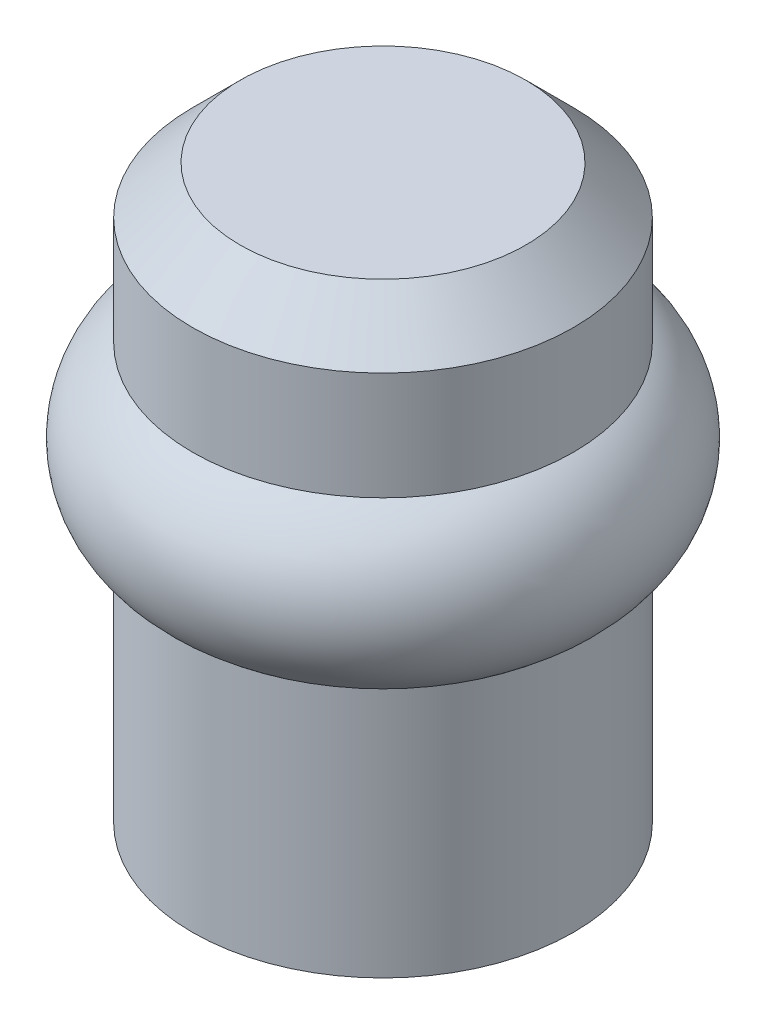
ISO-10303-21;
HEADER;
FILE_DESCRIPTION(('STEP AP214'),'2;1');
FILE_NAME('part.step','',(''),(''),'','','');
FILE_SCHEMA(('AUTOMOTIVE_DESIGN { 1 0 10303 214 1 1 1 1 }'));
ENDSEC;
DATA;
#1=APPLICATION_CONTEXT('core data for automotive mechanical design processes');
#2=APPLICATION_PROTOCOL_DEFINITION('international standard','automotive_design',2000,#1);
#3=PRODUCT_CONTEXT('',#1,'mechanical');
#4=PRODUCT('Part','Part','',(#3));
#5=PRODUCT_RELATED_PRODUCT_CATEGORY('part','',(#4));
#6=PRODUCT_DEFINITION_FORMATION('','',#4);
#7=PRODUCT_DEFINITION_CONTEXT('part definition',#1,'design');
#8=PRODUCT_DEFINITION('design','',#6,#7);
#9=PRODUCT_DEFINITION_SHAPE('','',#8);
#10=(LENGTH_UNIT() NAMED_UNIT(*) SI_UNIT(.MILLI.,.METRE.));
#11=(NAMED_UNIT(*) PLANE_ANGLE_UNIT() SI_UNIT($,.RADIAN.));
#12=(NAMED_UNIT(*) SI_UNIT($,.STERADIAN.) SOLID_ANGLE_UNIT());
#13=UNCERTAINTY_MEASURE_WITH_UNIT(LENGTH_MEASURE(1.E-05),#10,'distance_accuracy_value','');
#14=(GEOMETRIC_REPRESENTATION_CONTEXT(3) GLOBAL_UNCERTAINTY_ASSIGNED_CONTEXT((#13)) GLOBAL_UNIT_ASSIGNED_CONTEXT((#10,
#11,#12)) REPRESENTATION_CONTEXT('',''));
#15=CARTESIAN_POINT('',(0.,0.,0.));
#16=DIRECTION('',(0.,0.,1.));
#17=DIRECTION('',(1.,0.,0.));
#18=AXIS2_PLACEMENT_3D('',#15,#16,#17);
#19=CARTESIAN_POINT('',(0.,76.2,0.));
#20=DIRECTION('',(0.,-1.,0.));
#21=DIRECTION('',(0.,0.,-1.));
#22=AXIS2_PLACEMENT_3D('',#19,#20,#21);
#23=PLANE('',#22);
#24=CARTESIAN_POINT('',(0.,76.2,0.));
#25=DIRECTION('',(0.,-1.,0.));
#26=DIRECTION('',(0.,0.,-1.));
#27=AXIS2_PLACEMENT_3D('',#24,#25,#26);
#28=CIRCLE('',#27,19.05);
#29=CARTESIAN_POINT('',(0.,76.2,-19.05));
#30=VERTEX_POINT('',#29);
#31=EDGE_CURVE('E10',#30,#30,#28,.T.);
#32=ORIENTED_EDGE('',*,*,#31,.F.);
#33=EDGE_LOOP('',(#32));
#34=FACE_BOUND('',#33,.T.);
#35=ADVANCED_FACE('F37',(#34),#23,.F.);
#36=CARTESIAN_POINT('',(0.,76.2,0.));
#37=DIRECTION('',(0.,-1.,0.));
#38=DIRECTION('',(0.,0.,-1.));
#39=AXIS2_PLACEMENT_3D('',#36,#37,#38);
#40=CONICAL_SURFACE('',#39,19.05,0.785398163397449);
#41=CARTESIAN_POINT('',(0.,69.85,0.));
#42=DIRECTION('',(0.,-1.,0.));
#43=DIRECTION('',(0.,0.,-1.));
#44=AXIS2_PLACEMENT_3D('',#41,#42,#43);
#45=CIRCLE('',#44,25.4);
#46=CARTESIAN_POINT('',(0.,69.85,-25.4));
#47=VERTEX_POINT('',#46);
#48=EDGE_CURVE('E44',#47,#47,#45,.T.);
#49=ORIENTED_EDGE('',*,*,#48,.F.);
#50=EDGE_LOOP('',(#49));
#51=FACE_BOUND('',#50,.T.);
#52=ORIENTED_EDGE('',*,*,#31,.T.);
#53=EDGE_LOOP('',(#52));
#54=FACE_BOUND('',#53,.T.);
#55=ADVANCED_FACE('F81',(#51,#54),#40,.T.);
#56=CARTESIAN_POINT('',(0.,0.,0.));
#57=DIRECTION('',(0.,-1.,0.));
#58=DIRECTION('',(0.,0.,-1.));
#59=AXIS2_PLACEMENT_3D('',#56,#57,#58);
#60=CYLINDRICAL_SURFACE('',#59,25.4);
#61=CARTESIAN_POINT('',(0.,55.4485226280624,0.));
#62=DIRECTION('',(0.,-1.,0.));
#63=DIRECTION('',(0.,0.,-1.));
#64=AXIS2_PLACEMENT_3D('',#61,#62,#63);
#65=CIRCLE('',#64,25.4);
#66=CARTESIAN_POINT('',(0.,55.4485226280624,-25.4));
#67=VERTEX_POINT('',#66);
#68=EDGE_CURVE('E49',#67,#67,#65,.T.);
#69=ORIENTED_EDGE('',*,*,#68,.F.);
#70=EDGE_LOOP('',(#69));
#71=FACE_BOUND('',#70,.T.);
#72=ORIENTED_EDGE('',*,*,#48,.T.);
#73=EDGE_LOOP('',(#72));
#74=FACE_BOUND('',#73,.T.);
#75=ADVANCED_FACE('F76',(#71,#74),#60,.T.);
#76=CARTESIAN_POINT('',(0.,44.45,0.));
#77=DIRECTION('',(0.,-1.,0.));
#78=DIRECTION('',(0.,0.,-1.));
#79=AXIS2_PLACEMENT_3D('',#76,#77,#78);
#80=TOROIDAL_SURFACE('',#79,19.05,12.7);
#81=CARTESIAN_POINT('',(0.,33.4514773719376,0.));
#82=DIRECTION('',(0.,-1.,0.));
#83=DIRECTION('',(0.,0.,-1.));
#84=AXIS2_PLACEMENT_3D('',#81,#82,#83);
#85=CIRCLE('',#84,25.4);
#86=CARTESIAN_POINT('',(0.,33.4514773719376,-25.4));
#87=VERTEX_POINT('',#86);
#88=EDGE_CURVE('E54',#87,#87,#85,.T.);
#89=ORIENTED_EDGE('',*,*,#88,.F.);
#90=EDGE_LOOP('',(#89));
#91=FACE_BOUND('',#90,.T.);
#92=ORIENTED_EDGE('',*,*,#68,.T.);
#93=EDGE_LOOP('',(#92));
#94=FACE_BOUND('',#93,.T.);
#95=ADVANCED_FACE('F70',(#91,#94),#80,.T.);
#96=CARTESIAN_POINT('',(0.,0.,0.));
#97=DIRECTION('',(0.,-1.,0.));
#98=DIRECTION('',(0.,0.,-1.));
#99=AXIS2_PLACEMENT_3D('',#96,#97,#98);
#100=CYLINDRICAL_SURFACE('',#99,25.4);
#101=CARTESIAN_POINT('',(0.,0.,0.));
#102=DIRECTION('',(0.,-1.,0.));
#103=DIRECTION('',(0.,0.,-1.));
#104=AXIS2_PLACEMENT_3D('',#101,#102,#103);
#105=CIRCLE('',#104,25.4);
#106=CARTESIAN_POINT('',(0.,0.,-25.4));
#107=VERTEX_POINT('',#106);
#108=EDGE_CURVE('E60',#107,#107,#105,.T.);
#109=ORIENTED_EDGE('',*,*,#108,.F.);
#110=EDGE_LOOP('',(#109));
#111=FACE_BOUND('',#110,.T.);
#112=ORIENTED_EDGE('',*,*,#88,.T.);
#113=EDGE_LOOP('',(#112));
#114=FACE_BOUND('',#113,.T.);
#115=ADVANCED_FACE('F67',(#111,#114),#100,.T.);
#116=CARTESIAN_POINT('',(0.,0.,0.));
#117=DIRECTION('',(0.,1.,0.));
#118=DIRECTION('',(0.,0.,1.));
#119=AXIS2_PLACEMENT_3D('',#116,#117,#118);
#120=PLANE('',#119);
#121=ORIENTED_EDGE('',*,*,#108,.T.);
#122=EDGE_LOOP('',(#121));
#123=FACE_BOUND('',#122,.T.);
#124=ADVANCED_FACE('F65',(#123),#120,.F.);
#125=CLOSED_SHELL('',(#35,#55,#75,#95,#115,#124));
#126=MANIFOLD_SOLID_BREP('B2',#125);
#127=ADVANCED_BREP_SHAPE_REPRESENTATION('',(#18,#126),#14);
#128=SHAPE_DEFINITION_REPRESENTATION(#9,#127);
ENDSEC;
END-ISO-10303-21;
